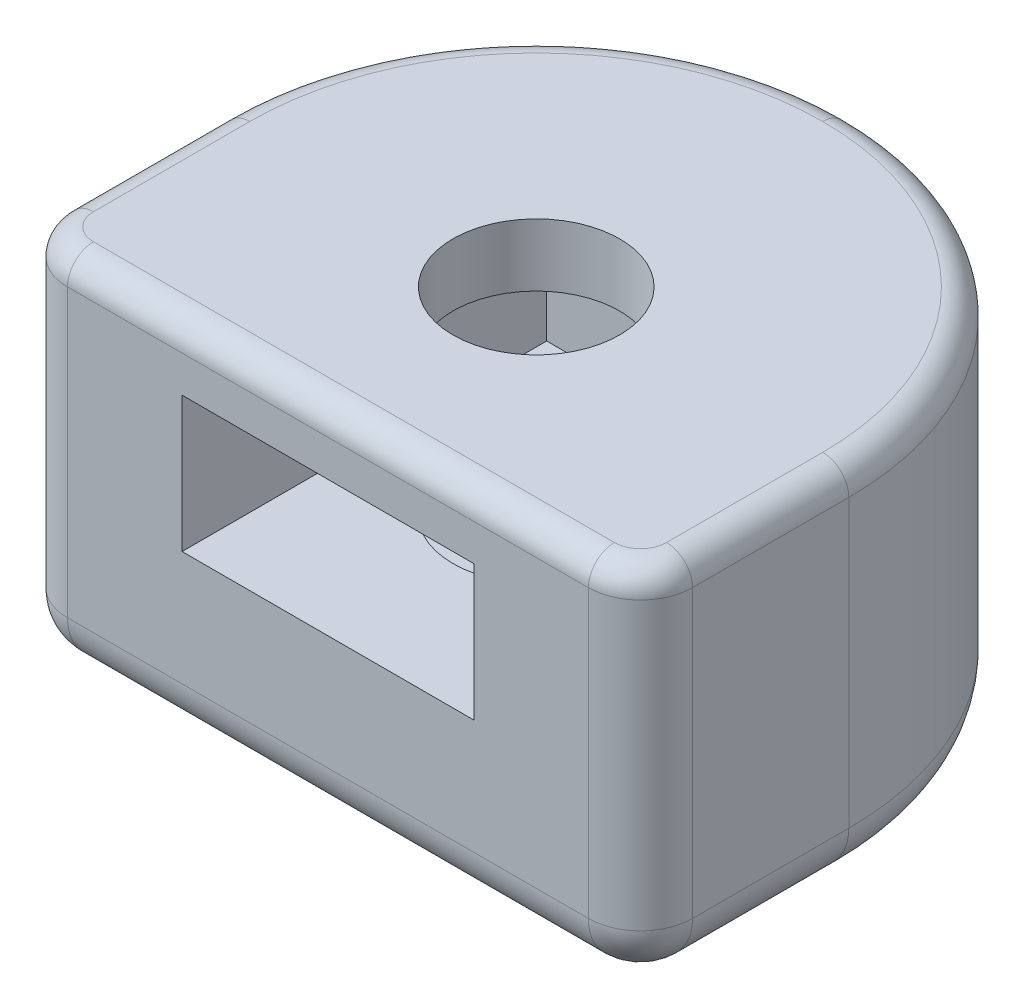
ISO-10303-21;
HEADER;
FILE_DESCRIPTION(('STEP AP214'),'2;1');
FILE_NAME('part.step','',(''),(''),'','','');
FILE_SCHEMA(('AUTOMOTIVE_DESIGN { 1 0 10303 214 1 1 1 1 }'));
ENDSEC;
DATA;
#1=APPLICATION_CONTEXT('core data for automotive mechanical design processes');
#2=APPLICATION_PROTOCOL_DEFINITION('international standard','automotive_design',2000,#1);
#3=PRODUCT_CONTEXT('',#1,'mechanical');
#4=PRODUCT('Part','Part','',(#3));
#5=PRODUCT_RELATED_PRODUCT_CATEGORY('part','',(#4));
#6=PRODUCT_DEFINITION_FORMATION('','',#4);
#7=PRODUCT_DEFINITION_CONTEXT('part definition',#1,'design');
#8=PRODUCT_DEFINITION('design','',#6,#7);
#9=PRODUCT_DEFINITION_SHAPE('','',#8);
#10=(LENGTH_UNIT() NAMED_UNIT(*) SI_UNIT(.MILLI.,.METRE.));
#11=(NAMED_UNIT(*) PLANE_ANGLE_UNIT() SI_UNIT($,.RADIAN.));
#12=(NAMED_UNIT(*) SI_UNIT($,.STERADIAN.) SOLID_ANGLE_UNIT());
#13=UNCERTAINTY_MEASURE_WITH_UNIT(LENGTH_MEASURE(1.E-05),#10,'distance_accuracy_value','');
#14=(GEOMETRIC_REPRESENTATION_CONTEXT(3) GLOBAL_UNCERTAINTY_ASSIGNED_CONTEXT((#13)) GLOBAL_UNIT_ASSIGNED_CONTEXT((#10,
#11,#12)) REPRESENTATION_CONTEXT('',''));
#15=CARTESIAN_POINT('',(0.,0.,0.));
#16=DIRECTION('',(0.,0.,1.));
#17=DIRECTION('',(1.,0.,0.));
#18=AXIS2_PLACEMENT_3D('',#15,#16,#17);
#19=CARTESIAN_POINT('',(6.,3.,-4.));
#20=DIRECTION('',(0.,1.,0.));
#21=DIRECTION('',(0.,0.,1.));
#22=AXIS2_PLACEMENT_3D('',#19,#20,#21);
#23=CYLINDRICAL_SURFACE('',#22,1.6);
#24=CARTESIAN_POINT('',(6.,5.8,-4.));
#25=DIRECTION('',(0.,1.,0.));
#26=DIRECTION('',(0.,0.,1.));
#27=AXIS2_PLACEMENT_3D('',#24,#25,#26);
#28=CIRCLE('',#27,1.6);
#29=CARTESIAN_POINT('',(6.,5.8,-2.4));
#30=VERTEX_POINT('',#29);
#31=EDGE_CURVE('E209',#30,#30,#28,.F.);
#32=ORIENTED_EDGE('',*,*,#31,.T.);
#33=EDGE_LOOP('',(#32));
#34=FACE_BOUND('',#33,.T.);
#35=CARTESIAN_POINT('',(6.,7.,-4.));
#36=DIRECTION('',(0.,1.,0.));
#37=DIRECTION('',(0.,0.,1.));
#38=AXIS2_PLACEMENT_3D('',#35,#36,#37);
#39=CIRCLE('',#38,1.6);
#40=CARTESIAN_POINT('',(6.,7.,-2.4));
#41=VERTEX_POINT('',#40);
#42=EDGE_CURVE('E206',#41,#41,#39,.T.);
#43=ORIENTED_EDGE('',*,*,#42,.T.);
#44=EDGE_LOOP('',(#43));
#45=FACE_BOUND('',#44,.T.);
#46=ADVANCED_FACE('F36',(#34,#45),#23,.F.);
#47=CARTESIAN_POINT('',(0.,7.,0.));
#48=DIRECTION('',(1.,0.,0.));
#49=DIRECTION('',(0.,0.,-1.));
#50=AXIS2_PLACEMENT_3D('',#47,#48,#49);
#51=PLANE('',#50);
#52=DIRECTION('',(0.,-1.,0.));
#53=VECTOR('',#52,1.);
#54=CARTESIAN_POINT('',(0.,7.,-1.));
#55=LINE('',#54,#53);
#56=CARTESIAN_POINT('',(0.,1.,-1.));
#57=VERTEX_POINT('',#56);
#58=CARTESIAN_POINT('',(0.,6.5,-1.));
#59=VERTEX_POINT('',#58);
#60=EDGE_CURVE('E254',#57,#59,#55,.F.);
#61=ORIENTED_EDGE('',*,*,#60,.T.);
#62=DIRECTION('',(0.,0.,1.));
#63=VECTOR('',#62,1.);
#64=CARTESIAN_POINT('',(0.,6.5,0.));
#65=LINE('',#64,#63);
#66=CARTESIAN_POINT('',(0.,6.5,-4.));
#67=VERTEX_POINT('',#66);
#68=EDGE_CURVE('E294',#59,#67,#65,.F.);
#69=ORIENTED_EDGE('',*,*,#68,.T.);
#70=DIRECTION('',(0.,-1.,0.));
#71=VECTOR('',#70,1.);
#72=CARTESIAN_POINT('',(0.,7.,-4.));
#73=LINE('',#72,#71);
#74=CARTESIAN_POINT('',(0.,1.,-4.));
#75=VERTEX_POINT('',#74);
#76=EDGE_CURVE('E205',#67,#75,#73,.T.);
#77=ORIENTED_EDGE('',*,*,#76,.T.);
#78=DIRECTION('',(0.,0.,1.));
#79=VECTOR('',#78,1.);
#80=CARTESIAN_POINT('',(0.,1.,0.));
#81=LINE('',#80,#79);
#82=EDGE_CURVE('E217',#75,#57,#81,.T.);
#83=ORIENTED_EDGE('',*,*,#82,.T.);
#84=EDGE_LOOP('',(#61,#69,#77,#83));
#85=FACE_BOUND('',#84,.T.);
#86=ADVANCED_FACE('F361',(#85),#51,.F.);
#87=CARTESIAN_POINT('',(0.,7.,0.));
#88=DIRECTION('',(0.,0.,-1.));
#89=DIRECTION('',(-1.,0.,0.));
#90=AXIS2_PLACEMENT_3D('',#87,#88,#89);
#91=PLANE('',#90);
#92=DIRECTION('',(0.,-1.,0.));
#93=VECTOR('',#92,1.);
#94=CARTESIAN_POINT('',(11.,7.,0.));
#95=LINE('',#94,#93);
#96=CARTESIAN_POINT('',(11.,1.,0.));
#97=VERTEX_POINT('',#96);
#98=CARTESIAN_POINT('',(11.,6.5,0.));
#99=VERTEX_POINT('',#98);
#100=EDGE_CURVE('E250',#97,#99,#95,.F.);
#101=ORIENTED_EDGE('',*,*,#100,.T.);
#102=DIRECTION('',(1.,0.,0.));
#103=VECTOR('',#102,1.);
#104=CARTESIAN_POINT('',(0.,6.5,0.));
#105=LINE('',#104,#103);
#106=CARTESIAN_POINT('',(1.,6.5,0.));
#107=VERTEX_POINT('',#106);
#108=EDGE_CURVE('E11',#99,#107,#105,.F.);
#109=ORIENTED_EDGE('',*,*,#108,.T.);
#110=DIRECTION('',(0.,-1.,0.));
#111=VECTOR('',#110,1.);
#112=CARTESIAN_POINT('',(1.,7.,0.));
#113=LINE('',#112,#111);
#114=CARTESIAN_POINT('',(1.,1.,0.));
#115=VERTEX_POINT('',#114);
#116=EDGE_CURVE('E252',#107,#115,#113,.T.);
#117=ORIENTED_EDGE('',*,*,#116,.T.);
#118=DIRECTION('',(1.,0.,0.));
#119=VECTOR('',#118,1.);
#120=CARTESIAN_POINT('',(11.,1.,0.));
#121=LINE('',#120,#119);
#122=EDGE_CURVE('E239',#115,#97,#121,.T.);
#123=ORIENTED_EDGE('',*,*,#122,.T.);
#124=EDGE_LOOP('',(#101,#109,#117,#123));
#125=FACE_BOUND('',#124,.T.);
#126=DIRECTION('',(1.,0.,0.));
#127=VECTOR('',#126,1.);
#128=CARTESIAN_POINT('',(3.2,3.2,0.));
#129=LINE('',#128,#127);
#130=CARTESIAN_POINT('',(3.2,3.2,0.));
#131=VERTEX_POINT('',#130);
#132=CARTESIAN_POINT('',(8.8,3.2,0.));
#133=VERTEX_POINT('',#132);
#134=EDGE_CURVE('E191',#131,#133,#129,.T.);
#135=ORIENTED_EDGE('',*,*,#134,.F.);
#136=DIRECTION('',(0.,-1.,0.));
#137=VECTOR('',#136,1.);
#138=CARTESIAN_POINT('',(3.2,5.8,0.));
#139=LINE('',#138,#137);
#140=CARTESIAN_POINT('',(3.2,5.8,0.));
#141=VERTEX_POINT('',#140);
#142=EDGE_CURVE('E164',#141,#131,#139,.T.);
#143=ORIENTED_EDGE('',*,*,#142,.F.);
#144=DIRECTION('',(-1.,0.,0.));
#145=VECTOR('',#144,1.);
#146=CARTESIAN_POINT('',(3.2,5.8,0.));
#147=LINE('',#146,#145);
#148=CARTESIAN_POINT('',(8.8,5.8,0.));
#149=VERTEX_POINT('',#148);
#150=EDGE_CURVE('E182',#149,#141,#147,.T.);
#151=ORIENTED_EDGE('',*,*,#150,.F.);
#152=DIRECTION('',(0.,1.,0.));
#153=VECTOR('',#152,1.);
#154=CARTESIAN_POINT('',(8.8,5.8,0.));
#155=LINE('',#154,#153);
#156=EDGE_CURVE('E185',#133,#149,#155,.T.);
#157=ORIENTED_EDGE('',*,*,#156,.F.);
#158=EDGE_LOOP('',(#135,#143,#151,#157));
#159=FACE_BOUND('',#158,.T.);
#160=ADVANCED_FACE('F344',(#125,#159),#91,.F.);
#161=CARTESIAN_POINT('',(12.,7.,0.));
#162=DIRECTION('',(-1.,0.,0.));
#163=DIRECTION('',(0.,0.,1.));
#164=AXIS2_PLACEMENT_3D('',#161,#162,#163);
#165=PLANE('',#164);
#166=DIRECTION('',(0.,-1.,0.));
#167=VECTOR('',#166,1.);
#168=CARTESIAN_POINT('',(12.,7.,-4.));
#169=LINE('',#168,#167);
#170=CARTESIAN_POINT('',(12.,1.,-4.));
#171=VERTEX_POINT('',#170);
#172=CARTESIAN_POINT('',(12.,6.5,-4.));
#173=VERTEX_POINT('',#172);
#174=EDGE_CURVE('E215',#171,#173,#169,.F.);
#175=ORIENTED_EDGE('',*,*,#174,.T.);
#176=DIRECTION('',(0.,0.,-1.));
#177=VECTOR('',#176,1.);
#178=CARTESIAN_POINT('',(12.,6.5,0.));
#179=LINE('',#178,#177);
#180=CARTESIAN_POINT('',(12.,6.5,-1.));
#181=VERTEX_POINT('',#180);
#182=EDGE_CURVE('E60',#173,#181,#179,.F.);
#183=ORIENTED_EDGE('',*,*,#182,.T.);
#184=DIRECTION('',(0.,-1.,0.));
#185=VECTOR('',#184,1.);
#186=CARTESIAN_POINT('',(12.,7.,-1.));
#187=LINE('',#186,#185);
#188=CARTESIAN_POINT('',(12.,1.,-1.));
#189=VERTEX_POINT('',#188);
#190=EDGE_CURVE('E259',#181,#189,#187,.T.);
#191=ORIENTED_EDGE('',*,*,#190,.T.);
#192=DIRECTION('',(0.,0.,-1.));
#193=VECTOR('',#192,1.);
#194=CARTESIAN_POINT('',(12.,1.,-4.));
#195=LINE('',#194,#193);
#196=EDGE_CURVE('E231',#189,#171,#195,.T.);
#197=ORIENTED_EDGE('',*,*,#196,.T.);
#198=EDGE_LOOP('',(#175,#183,#191,#197));
#199=FACE_BOUND('',#198,.T.);
#200=ADVANCED_FACE('F606',(#199),#165,.F.);
#201=CARTESIAN_POINT('',(0.,7.,0.));
#202=DIRECTION('',(0.,-1.,0.));
#203=DIRECTION('',(0.,0.,-1.));
#204=AXIS2_PLACEMENT_3D('',#201,#202,#203);
#205=PLANE('',#204);
#206=DIRECTION('',(0.,0.,1.));
#207=VECTOR('',#206,1.);
#208=CARTESIAN_POINT('',(0.5,7.,0.));
#209=LINE('',#208,#207);
#210=CARTESIAN_POINT('',(0.5,7.,-4.));
#211=VERTEX_POINT('',#210);
#212=CARTESIAN_POINT('',(0.5,7.,-1.));
#213=VERTEX_POINT('',#212);
#214=EDGE_CURVE('E286',#211,#213,#209,.T.);
#215=ORIENTED_EDGE('',*,*,#214,.T.);
#216=CARTESIAN_POINT('',(1.,7.,-1.));
#217=DIRECTION('',(0.,-1.,0.));
#218=DIRECTION('',(0.,0.,-1.));
#219=AXIS2_PLACEMENT_3D('',#216,#217,#218);
#220=CIRCLE('',#219,0.5);
#221=CARTESIAN_POINT('',(1.,7.,-0.5));
#222=VERTEX_POINT('',#221);
#223=EDGE_CURVE('E288',#213,#222,#220,.F.);
#224=ORIENTED_EDGE('',*,*,#223,.T.);
#225=DIRECTION('',(1.,0.,0.));
#226=VECTOR('',#225,1.);
#227=CARTESIAN_POINT('',(0.,7.,-0.5));
#228=LINE('',#227,#226);
#229=CARTESIAN_POINT('',(11.,7.,-0.5));
#230=VERTEX_POINT('',#229);
#231=EDGE_CURVE('E265',#222,#230,#228,.T.);
#232=ORIENTED_EDGE('',*,*,#231,.T.);
#233=CARTESIAN_POINT('',(11.,7.,-1.));
#234=DIRECTION('',(0.,-1.,0.));
#235=DIRECTION('',(0.,0.,-1.));
#236=AXIS2_PLACEMENT_3D('',#233,#234,#235);
#237=CIRCLE('',#236,0.5);
#238=CARTESIAN_POINT('',(11.5,7.,-1.));
#239=VERTEX_POINT('',#238);
#240=EDGE_CURVE('E278',#230,#239,#237,.F.);
#241=ORIENTED_EDGE('',*,*,#240,.T.);
#242=DIRECTION('',(0.,0.,-1.));
#243=VECTOR('',#242,1.);
#244=CARTESIAN_POINT('',(11.5,7.,0.));
#245=LINE('',#244,#243);
#246=CARTESIAN_POINT('',(11.5,7.,-4.));
#247=VERTEX_POINT('',#246);
#248=EDGE_CURVE('E280',#239,#247,#245,.T.);
#249=ORIENTED_EDGE('',*,*,#248,.T.);
#250=CARTESIAN_POINT('',(6.,7.,-4.));
#251=DIRECTION('',(0.,-1.,0.));
#252=DIRECTION('',(0.,0.,-1.));
#253=AXIS2_PLACEMENT_3D('',#250,#251,#252);
#254=CIRCLE('',#253,5.5);
#255=CARTESIAN_POINT('',(6.,7.,-9.5));
#256=VERTEX_POINT('',#255);
#257=EDGE_CURVE('E282',#247,#256,#254,.F.);
#258=ORIENTED_EDGE('',*,*,#257,.T.);
#259=CARTESIAN_POINT('',(6.,7.,-4.));
#260=DIRECTION('',(0.,-1.,0.));
#261=DIRECTION('',(0.,0.,-1.));
#262=AXIS2_PLACEMENT_3D('',#259,#260,#261);
#263=CIRCLE('',#262,5.5);
#264=EDGE_CURVE('E284',#256,#211,#263,.F.);
#265=ORIENTED_EDGE('',*,*,#264,.T.);
#266=EDGE_LOOP('',(#215,#224,#232,#241,#249,#258,#265));
#267=FACE_BOUND('',#266,.T.);
#268=ORIENTED_EDGE('',*,*,#42,.F.);
#269=EDGE_LOOP('',(#268));
#270=FACE_BOUND('',#269,.T.);
#271=ADVANCED_FACE('F330',(#267,#270),#205,.F.);
#272=CARTESIAN_POINT('',(0.,0.,0.));
#273=DIRECTION('',(0.,-1.,0.));
#274=DIRECTION('',(0.,0.,-1.));
#275=AXIS2_PLACEMENT_3D('',#272,#273,#274);
#276=PLANE('',#275);
#277=DIRECTION('',(0.,0.,-1.));
#278=VECTOR('',#277,1.);
#279=CARTESIAN_POINT('',(11.,0.,0.));
#280=LINE('',#279,#278);
#281=CARTESIAN_POINT('',(11.,0.,-4.));
#282=VERTEX_POINT('',#281);
#283=CARTESIAN_POINT('',(11.,0.,-1.));
#284=VERTEX_POINT('',#283);
#285=EDGE_CURVE('E226',#282,#284,#280,.F.);
#286=ORIENTED_EDGE('',*,*,#285,.T.);
#287=DIRECTION('',(1.,0.,0.));
#288=VECTOR('',#287,1.);
#289=CARTESIAN_POINT('',(1.,0.,-1.));
#290=LINE('',#289,#288);
#291=CARTESIAN_POINT('',(1.,0.,-1.));
#292=VERTEX_POINT('',#291);
#293=EDGE_CURVE('E263',#284,#292,#290,.F.);
#294=ORIENTED_EDGE('',*,*,#293,.T.);
#295=DIRECTION('',(0.,0.,1.));
#296=VECTOR('',#295,1.);
#297=CARTESIAN_POINT('',(1.,0.,-4.));
#298=LINE('',#297,#296);
#299=CARTESIAN_POINT('',(1.,0.,-4.));
#300=VERTEX_POINT('',#299);
#301=EDGE_CURVE('E229',#292,#300,#298,.F.);
#302=ORIENTED_EDGE('',*,*,#301,.T.);
#303=CARTESIAN_POINT('',(6.,0.,-4.));
#304=DIRECTION('',(0.,-1.,0.));
#305=DIRECTION('',(0.,0.,-1.));
#306=AXIS2_PLACEMENT_3D('',#303,#304,#305);
#307=CIRCLE('',#306,5.);
#308=CARTESIAN_POINT('',(6.,0.,-9.));
#309=VERTEX_POINT('',#308);
#310=EDGE_CURVE('E222',#300,#309,#307,.T.);
#311=ORIENTED_EDGE('',*,*,#310,.T.);
#312=CARTESIAN_POINT('',(6.,0.,-4.));
#313=DIRECTION('',(0.,-1.,0.));
#314=DIRECTION('',(0.,0.,-1.));
#315=AXIS2_PLACEMENT_3D('',#312,#313,#314);
#316=CIRCLE('',#315,5.);
#317=EDGE_CURVE('E224',#309,#282,#316,.T.);
#318=ORIENTED_EDGE('',*,*,#317,.T.);
#319=EDGE_LOOP('',(#286,#294,#302,#311,#318));
#320=FACE_BOUND('',#319,.T.);
#321=ADVANCED_FACE('F409',(#320),#276,.T.);
#322=CARTESIAN_POINT('',(3.2,5.8,-7.));
#323=DIRECTION('',(0.,1.,0.));
#324=DIRECTION('',(0.,0.,1.));
#325=AXIS2_PLACEMENT_3D('',#322,#323,#324);
#326=PLANE('',#325);
#327=ORIENTED_EDGE('',*,*,#150,.T.);
#328=DIRECTION('',(0.,0.,1.));
#329=VECTOR('',#328,1.);
#330=CARTESIAN_POINT('',(3.2,5.8,-7.));
#331=LINE('',#330,#329);
#332=CARTESIAN_POINT('',(3.2,5.8,-7.));
#333=VERTEX_POINT('',#332);
#334=EDGE_CURVE('E196',#333,#141,#331,.T.);
#335=ORIENTED_EDGE('',*,*,#334,.F.);
#336=DIRECTION('',(-1.,0.,0.));
#337=VECTOR('',#336,1.);
#338=CARTESIAN_POINT('',(3.2,5.8,-7.));
#339=LINE('',#338,#337);
#340=CARTESIAN_POINT('',(8.8,5.8,-7.));
#341=VERTEX_POINT('',#340);
#342=EDGE_CURVE('E169',#341,#333,#339,.T.);
#343=ORIENTED_EDGE('',*,*,#342,.F.);
#344=DIRECTION('',(0.,0.,1.));
#345=VECTOR('',#344,1.);
#346=CARTESIAN_POINT('',(8.8,5.8,-7.));
#347=LINE('',#346,#345);
#348=EDGE_CURVE('E199',#341,#149,#347,.T.);
#349=ORIENTED_EDGE('',*,*,#348,.T.);
#350=EDGE_LOOP('',(#327,#335,#343,#349));
#351=FACE_BOUND('',#350,.T.);
#352=ORIENTED_EDGE('',*,*,#31,.F.);
#353=EDGE_LOOP('',(#352));
#354=FACE_BOUND('',#353,.T.);
#355=ADVANCED_FACE('F401',(#351,#354),#326,.F.);
#356=CARTESIAN_POINT('',(3.2,3.2,-7.));
#357=DIRECTION('',(0.,-1.,0.));
#358=DIRECTION('',(0.,0.,-1.));
#359=AXIS2_PLACEMENT_3D('',#356,#357,#358);
#360=PLANE('',#359);
#361=ORIENTED_EDGE('',*,*,#134,.T.);
#362=DIRECTION('',(0.,0.,1.));
#363=VECTOR('',#362,1.);
#364=CARTESIAN_POINT('',(8.8,3.2,-7.));
#365=LINE('',#364,#363);
#366=CARTESIAN_POINT('',(8.8,3.2,-7.));
#367=VERTEX_POINT('',#366);
#368=EDGE_CURVE('E168',#367,#133,#365,.T.);
#369=ORIENTED_EDGE('',*,*,#368,.F.);
#370=DIRECTION('',(1.,0.,0.));
#371=VECTOR('',#370,1.);
#372=CARTESIAN_POINT('',(3.2,3.2,-7.));
#373=LINE('',#372,#371);
#374=CARTESIAN_POINT('',(3.2,3.2,-7.));
#375=VERTEX_POINT('',#374);
#376=EDGE_CURVE('E172',#375,#367,#373,.T.);
#377=ORIENTED_EDGE('',*,*,#376,.F.);
#378=DIRECTION('',(0.,0.,1.));
#379=VECTOR('',#378,1.);
#380=CARTESIAN_POINT('',(3.2,3.2,-7.));
#381=LINE('',#380,#379);
#382=EDGE_CURVE('E157',#375,#131,#381,.T.);
#383=ORIENTED_EDGE('',*,*,#382,.T.);
#384=EDGE_LOOP('',(#361,#369,#377,#383));
#385=FACE_BOUND('',#384,.T.);
#386=CARTESIAN_POINT('',(6.,3.2,-4.));
#387=DIRECTION('',(0.,-1.,0.));
#388=DIRECTION('',(0.,0.,-1.));
#389=AXIS2_PLACEMENT_3D('',#386,#387,#388);
#390=CIRCLE('',#389,1.6);
#391=CARTESIAN_POINT('',(6.,3.2,-5.6));
#392=VERTEX_POINT('',#391);
#393=EDGE_CURVE('E198',#392,#392,#390,.F.);
#394=ORIENTED_EDGE('',*,*,#393,.F.);
#395=EDGE_LOOP('',(#394));
#396=FACE_BOUND('',#395,.T.);
#397=ADVANCED_FACE('F173',(#385,#396),#360,.F.);
#398=CARTESIAN_POINT('',(3.2,5.8,-7.));
#399=DIRECTION('',(-1.,0.,0.));
#400=DIRECTION('',(0.,-1.,0.));
#401=AXIS2_PLACEMENT_3D('',#398,#399,#400);
#402=PLANE('',#401);
#403=ORIENTED_EDGE('',*,*,#142,.T.);
#404=ORIENTED_EDGE('',*,*,#382,.F.);
#405=DIRECTION('',(0.,-1.,0.));
#406=VECTOR('',#405,1.);
#407=CARTESIAN_POINT('',(3.2,5.8,-7.));
#408=LINE('',#407,#406);
#409=EDGE_CURVE('E161',#333,#375,#408,.T.);
#410=ORIENTED_EDGE('',*,*,#409,.F.);
#411=ORIENTED_EDGE('',*,*,#334,.T.);
#412=EDGE_LOOP('',(#403,#404,#410,#411));
#413=FACE_BOUND('',#412,.T.);
#414=ADVANCED_FACE('F159',(#413),#402,.F.);
#415=CARTESIAN_POINT('',(8.8,5.8,-7.));
#416=DIRECTION('',(1.,0.,0.));
#417=DIRECTION('',(0.,1.,0.));
#418=AXIS2_PLACEMENT_3D('',#415,#416,#417);
#419=PLANE('',#418);
#420=ORIENTED_EDGE('',*,*,#156,.T.);
#421=ORIENTED_EDGE('',*,*,#348,.F.);
#422=DIRECTION('',(0.,1.,0.));
#423=VECTOR('',#422,1.);
#424=CARTESIAN_POINT('',(8.8,5.8,-7.));
#425=LINE('',#424,#423);
#426=EDGE_CURVE('E178',#367,#341,#425,.T.);
#427=ORIENTED_EDGE('',*,*,#426,.F.);
#428=ORIENTED_EDGE('',*,*,#368,.T.);
#429=EDGE_LOOP('',(#420,#421,#427,#428));
#430=FACE_BOUND('',#429,.T.);
#431=ADVANCED_FACE('F407',(#430),#419,.F.);
#432=CARTESIAN_POINT('',(0.,0.,-7.));
#433=DIRECTION('',(0.,0.,1.));
#434=DIRECTION('',(1.,0.,0.));
#435=AXIS2_PLACEMENT_3D('',#432,#433,#434);
#436=PLANE('',#435);
#437=ORIENTED_EDGE('',*,*,#409,.T.);
#438=ORIENTED_EDGE('',*,*,#376,.T.);
#439=ORIENTED_EDGE('',*,*,#426,.T.);
#440=ORIENTED_EDGE('',*,*,#342,.T.);
#441=EDGE_LOOP('',(#437,#438,#439,#440));
#442=FACE_BOUND('',#441,.T.);
#443=ADVANCED_FACE('F180',(#442),#436,.T.);
#444=CARTESIAN_POINT('',(6.,3.,-4.));
#445=DIRECTION('',(0.,1.,0.));
#446=DIRECTION('',(0.,0.,1.));
#447=AXIS2_PLACEMENT_3D('',#444,#445,#446);
#448=PLANE('',#447);
#449=CARTESIAN_POINT('',(6.,3.,-4.));
#450=DIRECTION('',(0.,1.,0.));
#451=DIRECTION('',(0.,0.,1.));
#452=AXIS2_PLACEMENT_3D('',#449,#450,#451);
#453=CIRCLE('',#452,1.6);
#454=CARTESIAN_POINT('',(6.,3.,-2.4));
#455=VERTEX_POINT('',#454);
#456=EDGE_CURVE('E202',#455,#455,#453,.T.);
#457=ORIENTED_EDGE('',*,*,#456,.T.);
#458=EDGE_LOOP('',(#457));
#459=FACE_BOUND('',#458,.T.);
#460=ADVANCED_FACE('F388',(#459),#448,.T.);
#461=ORIENTED_EDGE('',*,*,#393,.T.);
#462=EDGE_LOOP('',(#461));
#463=FACE_BOUND('',#462,.T.);
#464=ORIENTED_EDGE('',*,*,#456,.F.);
#465=EDGE_LOOP('',(#464));
#466=FACE_BOUND('',#465,.T.);
#467=ADVANCED_FACE('F378',(#463,#466),#23,.F.);
#468=CARTESIAN_POINT('',(6.,7.,-4.));
#469=DIRECTION('',(0.,-1.,0.));
#470=DIRECTION('',(0.,0.,-1.));
#471=AXIS2_PLACEMENT_3D('',#468,#469,#470);
#472=CYLINDRICAL_SURFACE('',#471,6.);
#473=DIRECTION('',(0.,-1.,0.));
#474=VECTOR('',#473,1.);
#475=CARTESIAN_POINT('',(6.,7.,-10.));
#476=LINE('',#475,#474);
#477=CARTESIAN_POINT('',(6.,6.5,-10.));
#478=VERTEX_POINT('',#477);
#479=CARTESIAN_POINT('',(6.,1.,-10.));
#480=VERTEX_POINT('',#479);
#481=EDGE_CURVE('E192',#478,#480,#476,.T.);
#482=ORIENTED_EDGE('',*,*,#481,.F.);
#483=CARTESIAN_POINT('',(6.,6.5,-4.));
#484=DIRECTION('',(0.,-1.,0.));
#485=DIRECTION('',(0.,0.,-1.));
#486=AXIS2_PLACEMENT_3D('',#483,#484,#485);
#487=CIRCLE('',#486,6.);
#488=EDGE_CURVE('E298',#478,#173,#487,.T.);
#489=ORIENTED_EDGE('',*,*,#488,.T.);
#490=ORIENTED_EDGE('',*,*,#174,.F.);
#491=CARTESIAN_POINT('',(6.,1.,-4.));
#492=DIRECTION('',(0.,-1.,0.));
#493=DIRECTION('',(0.,0.,-1.));
#494=AXIS2_PLACEMENT_3D('',#491,#492,#493);
#495=CIRCLE('',#494,6.);
#496=EDGE_CURVE('E233',#171,#480,#495,.F.);
#497=ORIENTED_EDGE('',*,*,#496,.T.);
#498=EDGE_LOOP('',(#482,#489,#490,#497));
#499=FACE_BOUND('',#498,.T.);
#500=ADVANCED_FACE('F387',(#499),#472,.T.);
#501=CARTESIAN_POINT('',(6.,7.,-4.));
#502=DIRECTION('',(0.,-1.,0.));
#503=DIRECTION('',(0.,0.,-1.));
#504=AXIS2_PLACEMENT_3D('',#501,#502,#503);
#505=CYLINDRICAL_SURFACE('',#504,6.);
#506=ORIENTED_EDGE('',*,*,#76,.F.);
#507=CARTESIAN_POINT('',(6.,6.5,-4.));
#508=DIRECTION('',(0.,-1.,0.));
#509=DIRECTION('',(0.,0.,-1.));
#510=AXIS2_PLACEMENT_3D('',#507,#508,#509);
#511=CIRCLE('',#510,6.);
#512=EDGE_CURVE('E296',#67,#478,#511,.T.);
#513=ORIENTED_EDGE('',*,*,#512,.T.);
#514=ORIENTED_EDGE('',*,*,#481,.T.);
#515=CARTESIAN_POINT('',(6.,1.,-4.));
#516=DIRECTION('',(0.,-1.,0.));
#517=DIRECTION('',(0.,0.,-1.));
#518=AXIS2_PLACEMENT_3D('',#515,#516,#517);
#519=CIRCLE('',#518,6.);
#520=EDGE_CURVE('E236',#480,#75,#519,.F.);
#521=ORIENTED_EDGE('',*,*,#520,.T.);
#522=EDGE_LOOP('',(#506,#513,#514,#521));
#523=FACE_BOUND('',#522,.T.);
#524=ADVANCED_FACE('F363',(#523),#505,.T.);
#525=CARTESIAN_POINT('',(11.,1.,0.));
#526=DIRECTION('',(0.,0.,1.));
#527=DIRECTION('',(1.,0.,0.));
#528=AXIS2_PLACEMENT_3D('',#525,#526,#527);
#529=CYLINDRICAL_SURFACE('',#528,1.);
#530=ORIENTED_EDGE('',*,*,#196,.F.);
#531=CARTESIAN_POINT('',(11.,1.,-1.));
#532=DIRECTION('',(0.,0.,1.));
#533=DIRECTION('',(1.,0.,0.));
#534=AXIS2_PLACEMENT_3D('',#531,#532,#533);
#535=CIRCLE('',#534,1.);
#536=EDGE_CURVE('E261',#189,#284,#535,.F.);
#537=ORIENTED_EDGE('',*,*,#536,.T.);
#538=ORIENTED_EDGE('',*,*,#285,.F.);
#539=CARTESIAN_POINT('',(11.,1.,-4.));
#540=DIRECTION('',(0.,0.,-1.));
#541=DIRECTION('',(-1.,0.,0.));
#542=AXIS2_PLACEMENT_3D('',#539,#540,#541);
#543=CIRCLE('',#542,1.);
#544=EDGE_CURVE('E219',#171,#282,#543,.T.);
#545=ORIENTED_EDGE('',*,*,#544,.F.);
#546=EDGE_LOOP('',(#530,#537,#538,#545));
#547=FACE_BOUND('',#546,.T.);
#548=ADVANCED_FACE('F469',(#547),#529,.T.);
#549=CARTESIAN_POINT('',(6.,1.,-4.));
#550=DIRECTION('',(0.,-1.,0.));
#551=DIRECTION('',(0.,0.,-1.));
#552=AXIS2_PLACEMENT_3D('',#549,#550,#551);
#553=TOROIDAL_SURFACE('',#552,5.,1.);
#554=ORIENTED_EDGE('',*,*,#544,.T.);
#555=ORIENTED_EDGE('',*,*,#317,.F.);
#556=CARTESIAN_POINT('',(6.,1.,-9.));
#557=DIRECTION('',(-1.,0.,0.));
#558=DIRECTION('',(0.,0.,1.));
#559=AXIS2_PLACEMENT_3D('',#556,#557,#558);
#560=CIRCLE('',#559,1.);
#561=EDGE_CURVE('E243',#480,#309,#560,.T.);
#562=ORIENTED_EDGE('',*,*,#561,.F.);
#563=ORIENTED_EDGE('',*,*,#496,.F.);
#564=EDGE_LOOP('',(#554,#555,#562,#563));
#565=FACE_BOUND('',#564,.T.);
#566=ADVANCED_FACE('F478',(#565),#553,.T.);
#567=CARTESIAN_POINT('',(6.,1.,-4.));
#568=DIRECTION('',(0.,-1.,0.));
#569=DIRECTION('',(0.,0.,-1.));
#570=AXIS2_PLACEMENT_3D('',#567,#568,#569);
#571=TOROIDAL_SURFACE('',#570,5.,1.);
#572=ORIENTED_EDGE('',*,*,#561,.T.);
#573=ORIENTED_EDGE('',*,*,#310,.F.);
#574=CARTESIAN_POINT('',(1.,1.,-4.));
#575=DIRECTION('',(0.,0.,1.));
#576=DIRECTION('',(1.,0.,0.));
#577=AXIS2_PLACEMENT_3D('',#574,#575,#576);
#578=CIRCLE('',#577,1.);
#579=EDGE_CURVE('E240',#75,#300,#578,.T.);
#580=ORIENTED_EDGE('',*,*,#579,.F.);
#581=ORIENTED_EDGE('',*,*,#520,.F.);
#582=EDGE_LOOP('',(#572,#573,#580,#581));
#583=FACE_BOUND('',#582,.T.);
#584=ADVANCED_FACE('F489',(#583),#571,.T.);
#585=CARTESIAN_POINT('',(1.,1.,0.));
#586=DIRECTION('',(0.,0.,-1.));
#587=DIRECTION('',(-1.,0.,0.));
#588=AXIS2_PLACEMENT_3D('',#585,#586,#587);
#589=CYLINDRICAL_SURFACE('',#588,1.);
#590=ORIENTED_EDGE('',*,*,#301,.F.);
#591=CARTESIAN_POINT('',(1.,1.,-1.));
#592=DIRECTION('',(0.,0.,-1.));
#593=DIRECTION('',(-1.,0.,0.));
#594=AXIS2_PLACEMENT_3D('',#591,#592,#593);
#595=CIRCLE('',#594,1.);
#596=EDGE_CURVE('E257',#292,#57,#595,.T.);
#597=ORIENTED_EDGE('',*,*,#596,.T.);
#598=ORIENTED_EDGE('',*,*,#82,.F.);
#599=ORIENTED_EDGE('',*,*,#579,.T.);
#600=EDGE_LOOP('',(#590,#597,#598,#599));
#601=FACE_BOUND('',#600,.T.);
#602=ADVANCED_FACE('F498',(#601),#589,.T.);
#603=CARTESIAN_POINT('',(11.,7.,-1.));
#604=DIRECTION('',(0.,-1.,0.));
#605=DIRECTION('',(0.,0.,-1.));
#606=AXIS2_PLACEMENT_3D('',#603,#604,#605);
#607=CYLINDRICAL_SURFACE('',#606,1.);
#608=ORIENTED_EDGE('',*,*,#190,.F.);
#609=CARTESIAN_POINT('',(11.,6.5,-1.));
#610=DIRECTION('',(0.,-1.,0.));
#611=DIRECTION('',(0.,0.,-1.));
#612=AXIS2_PLACEMENT_3D('',#609,#610,#611);
#613=CIRCLE('',#612,1.);
#614=EDGE_CURVE('E45',#181,#99,#613,.T.);
#615=ORIENTED_EDGE('',*,*,#614,.T.);
#616=ORIENTED_EDGE('',*,*,#100,.F.);
#617=CARTESIAN_POINT('',(11.,1.,-1.));
#618=DIRECTION('',(0.,-1.,0.));
#619=DIRECTION('',(0.,0.,-1.));
#620=AXIS2_PLACEMENT_3D('',#617,#618,#619);
#621=CIRCLE('',#620,1.);
#622=EDGE_CURVE('E244',#189,#97,#621,.T.);
#623=ORIENTED_EDGE('',*,*,#622,.F.);
#624=EDGE_LOOP('',(#608,#615,#616,#623));
#625=FACE_BOUND('',#624,.T.);
#626=ADVANCED_FACE('F506',(#625),#607,.T.);
#627=CARTESIAN_POINT('',(11.,1.,-1.));
#628=DIRECTION('',(0.,0.,-1.));
#629=DIRECTION('',(-1.,0.,0.));
#630=AXIS2_PLACEMENT_3D('',#627,#628,#629);
#631=SPHERICAL_SURFACE('',#630,1.);
#632=ORIENTED_EDGE('',*,*,#536,.F.);
#633=ORIENTED_EDGE('',*,*,#622,.T.);
#634=CARTESIAN_POINT('',(11.,1.,-1.));
#635=DIRECTION('',(-1.,0.,0.));
#636=DIRECTION('',(0.,0.,1.));
#637=AXIS2_PLACEMENT_3D('',#634,#635,#636);
#638=CIRCLE('',#637,1.);
#639=EDGE_CURVE('E272',#284,#97,#638,.T.);
#640=ORIENTED_EDGE('',*,*,#639,.F.);
#641=EDGE_LOOP('',(#632,#633,#640));
#642=FACE_BOUND('',#641,.T.);
#643=ADVANCED_FACE('F515',(#642),#631,.T.);
#644=CARTESIAN_POINT('',(0.,1.,-1.));
#645=DIRECTION('',(-1.,0.,0.));
#646=DIRECTION('',(0.,0.,1.));
#647=AXIS2_PLACEMENT_3D('',#644,#645,#646);
#648=CYLINDRICAL_SURFACE('',#647,1.);
#649=CARTESIAN_POINT('',(1.,1.,-1.));
#650=DIRECTION('',(-1.,0.,0.));
#651=DIRECTION('',(0.,0.,1.));
#652=AXIS2_PLACEMENT_3D('',#649,#650,#651);
#653=CIRCLE('',#652,1.);
#654=EDGE_CURVE('E269',#292,#115,#653,.T.);
#655=ORIENTED_EDGE('',*,*,#654,.F.);
#656=ORIENTED_EDGE('',*,*,#293,.F.);
#657=ORIENTED_EDGE('',*,*,#639,.T.);
#658=ORIENTED_EDGE('',*,*,#122,.F.);
#659=EDGE_LOOP('',(#655,#656,#657,#658));
#660=FACE_BOUND('',#659,.T.);
#661=ADVANCED_FACE('F524',(#660),#648,.T.);
#662=CARTESIAN_POINT('',(1.,1.,-1.));
#663=DIRECTION('',(0.,0.,-1.));
#664=DIRECTION('',(-1.,0.,0.));
#665=AXIS2_PLACEMENT_3D('',#662,#663,#664);
#666=SPHERICAL_SURFACE('',#665,1.);
#667=ORIENTED_EDGE('',*,*,#596,.F.);
#668=ORIENTED_EDGE('',*,*,#654,.T.);
#669=CARTESIAN_POINT('',(1.,1.,-1.));
#670=DIRECTION('',(0.,1.,0.));
#671=DIRECTION('',(0.,0.,1.));
#672=AXIS2_PLACEMENT_3D('',#669,#670,#671);
#673=CIRCLE('',#672,1.);
#674=EDGE_CURVE('E266',#57,#115,#673,.T.);
#675=ORIENTED_EDGE('',*,*,#674,.F.);
#676=EDGE_LOOP('',(#667,#668,#675));
#677=FACE_BOUND('',#676,.T.);
#678=ADVANCED_FACE('F536',(#677),#666,.T.);
#679=CARTESIAN_POINT('',(1.,7.,-1.));
#680=DIRECTION('',(0.,-1.,0.));
#681=DIRECTION('',(0.,0.,-1.));
#682=AXIS2_PLACEMENT_3D('',#679,#680,#681);
#683=CYLINDRICAL_SURFACE('',#682,1.);
#684=ORIENTED_EDGE('',*,*,#116,.F.);
#685=CARTESIAN_POINT('',(1.,6.5,-1.));
#686=DIRECTION('',(0.,-1.,0.));
#687=DIRECTION('',(0.,0.,-1.));
#688=AXIS2_PLACEMENT_3D('',#685,#686,#687);
#689=CIRCLE('',#688,1.);
#690=EDGE_CURVE('E291',#107,#59,#689,.T.);
#691=ORIENTED_EDGE('',*,*,#690,.T.);
#692=ORIENTED_EDGE('',*,*,#60,.F.);
#693=ORIENTED_EDGE('',*,*,#674,.T.);
#694=EDGE_LOOP('',(#684,#691,#692,#693));
#695=FACE_BOUND('',#694,.T.);
#696=ADVANCED_FACE('F348',(#695),#683,.T.);
#697=CARTESIAN_POINT('',(6.,6.5,-4.));
#698=DIRECTION('',(0.,-1.,0.));
#699=DIRECTION('',(0.,0.,-1.));
#700=AXIS2_PLACEMENT_3D('',#697,#698,#699);
#701=TOROIDAL_SURFACE('',#700,5.5,0.5);
#702=CARTESIAN_POINT('',(6.,6.5,-9.5));
#703=DIRECTION('',(-1.,0.,0.));
#704=DIRECTION('',(0.,0.,1.));
#705=AXIS2_PLACEMENT_3D('',#702,#703,#704);
#706=CIRCLE('',#705,0.5);
#707=EDGE_CURVE('E314',#256,#478,#706,.T.);
#708=ORIENTED_EDGE('',*,*,#707,.F.);
#709=ORIENTED_EDGE('',*,*,#257,.F.);
#710=CARTESIAN_POINT('',(11.5,6.5,-4.));
#711=DIRECTION('',(0.,0.,1.));
#712=DIRECTION('',(1.,0.,0.));
#713=AXIS2_PLACEMENT_3D('',#710,#711,#712);
#714=CIRCLE('',#713,0.5);
#715=EDGE_CURVE('E40',#173,#247,#714,.T.);
#716=ORIENTED_EDGE('',*,*,#715,.F.);
#717=ORIENTED_EDGE('',*,*,#488,.F.);
#718=EDGE_LOOP('',(#708,#709,#716,#717));
#719=FACE_BOUND('',#718,.T.);
#720=ADVANCED_FACE('F38',(#719),#701,.T.);
#721=CARTESIAN_POINT('',(11.5,6.5,0.));
#722=DIRECTION('',(0.,0.,-1.));
#723=DIRECTION('',(-1.,0.,0.));
#724=AXIS2_PLACEMENT_3D('',#721,#722,#723);
#725=CYLINDRICAL_SURFACE('',#724,0.5);
#726=ORIENTED_EDGE('',*,*,#715,.T.);
#727=ORIENTED_EDGE('',*,*,#248,.F.);
#728=CARTESIAN_POINT('',(11.5,6.5,-1.));
#729=DIRECTION('',(0.,0.,1.));
#730=DIRECTION('',(1.,0.,0.));
#731=AXIS2_PLACEMENT_3D('',#728,#729,#730);
#732=CIRCLE('',#731,0.5);
#733=EDGE_CURVE('E312',#181,#239,#732,.T.);
#734=ORIENTED_EDGE('',*,*,#733,.F.);
#735=ORIENTED_EDGE('',*,*,#182,.F.);
#736=EDGE_LOOP('',(#726,#727,#734,#735));
#737=FACE_BOUND('',#736,.T.);
#738=ADVANCED_FACE('F324',(#737),#725,.T.);
#739=CARTESIAN_POINT('',(6.,6.5,-4.));
#740=DIRECTION('',(0.,-1.,0.));
#741=DIRECTION('',(0.,0.,-1.));
#742=AXIS2_PLACEMENT_3D('',#739,#740,#741);
#743=TOROIDAL_SURFACE('',#742,5.5,0.5);
#744=ORIENTED_EDGE('',*,*,#707,.T.);
#745=ORIENTED_EDGE('',*,*,#512,.F.);
#746=CARTESIAN_POINT('',(0.5,6.5,-4.));
#747=DIRECTION('',(0.,0.,1.));
#748=DIRECTION('',(1.,0.,0.));
#749=AXIS2_PLACEMENT_3D('',#746,#747,#748);
#750=CIRCLE('',#749,0.5);
#751=EDGE_CURVE('E309',#211,#67,#750,.T.);
#752=ORIENTED_EDGE('',*,*,#751,.F.);
#753=ORIENTED_EDGE('',*,*,#264,.F.);
#754=EDGE_LOOP('',(#744,#745,#752,#753));
#755=FACE_BOUND('',#754,.T.);
#756=ADVANCED_FACE('F367',(#755),#743,.T.);
#757=CARTESIAN_POINT('',(11.,6.5,-1.));
#758=DIRECTION('',(0.,-1.,0.));
#759=DIRECTION('',(0.,0.,-1.));
#760=AXIS2_PLACEMENT_3D('',#757,#758,#759);
#761=DEGENERATE_TOROIDAL_SURFACE('',#760,0.5,0.5,.T.);
#762=ORIENTED_EDGE('',*,*,#733,.T.);
#763=ORIENTED_EDGE('',*,*,#240,.F.);
#764=CARTESIAN_POINT('',(11.,6.5,-0.5));
#765=DIRECTION('',(-1.,0.,0.));
#766=DIRECTION('',(0.,0.,1.));
#767=AXIS2_PLACEMENT_3D('',#764,#765,#766);
#768=CIRCLE('',#767,0.5);
#769=EDGE_CURVE('E306',#99,#230,#768,.T.);
#770=ORIENTED_EDGE('',*,*,#769,.F.);
#771=ORIENTED_EDGE('',*,*,#614,.F.);
#772=EDGE_LOOP('',(#762,#763,#770,#771));
#773=FACE_BOUND('',#772,.T.);
#774=ADVANCED_FACE('F337',(#773),#761,.T.);
#775=CARTESIAN_POINT('',(0.5,6.5,0.));
#776=DIRECTION('',(0.,0.,1.));
#777=DIRECTION('',(1.,0.,0.));
#778=AXIS2_PLACEMENT_3D('',#775,#776,#777);
#779=CYLINDRICAL_SURFACE('',#778,0.5);
#780=ORIENTED_EDGE('',*,*,#751,.T.);
#781=ORIENTED_EDGE('',*,*,#68,.F.);
#782=CARTESIAN_POINT('',(0.5,6.5,-1.));
#783=DIRECTION('',(0.,0.,1.));
#784=DIRECTION('',(1.,0.,0.));
#785=AXIS2_PLACEMENT_3D('',#782,#783,#784);
#786=CIRCLE('',#785,0.5);
#787=EDGE_CURVE('E304',#213,#59,#786,.T.);
#788=ORIENTED_EDGE('',*,*,#787,.F.);
#789=ORIENTED_EDGE('',*,*,#214,.F.);
#790=EDGE_LOOP('',(#780,#781,#788,#789));
#791=FACE_BOUND('',#790,.T.);
#792=ADVANCED_FACE('F358',(#791),#779,.T.);
#793=CARTESIAN_POINT('',(0.,6.5,-0.5));
#794=DIRECTION('',(1.,0.,0.));
#795=DIRECTION('',(0.,0.,-1.));
#796=AXIS2_PLACEMENT_3D('',#793,#794,#795);
#797=CYLINDRICAL_SURFACE('',#796,0.5);
#798=ORIENTED_EDGE('',*,*,#769,.T.);
#799=ORIENTED_EDGE('',*,*,#231,.F.);
#800=CARTESIAN_POINT('',(1.,6.5,-0.5));
#801=DIRECTION('',(-1.,0.,0.));
#802=DIRECTION('',(0.,0.,1.));
#803=AXIS2_PLACEMENT_3D('',#800,#801,#802);
#804=CIRCLE('',#803,0.5);
#805=EDGE_CURVE('E302',#107,#222,#804,.T.);
#806=ORIENTED_EDGE('',*,*,#805,.F.);
#807=ORIENTED_EDGE('',*,*,#108,.F.);
#808=EDGE_LOOP('',(#798,#799,#806,#807));
#809=FACE_BOUND('',#808,.T.);
#810=ADVANCED_FACE('F340',(#809),#797,.T.);
#811=CARTESIAN_POINT('',(1.,6.5,-1.));
#812=DIRECTION('',(0.,-1.,0.));
#813=DIRECTION('',(0.,0.,-1.));
#814=AXIS2_PLACEMENT_3D('',#811,#812,#813);
#815=DEGENERATE_TOROIDAL_SURFACE('',#814,0.5,0.5,.T.);
#816=ORIENTED_EDGE('',*,*,#787,.T.);
#817=ORIENTED_EDGE('',*,*,#690,.F.);
#818=ORIENTED_EDGE('',*,*,#805,.T.);
#819=ORIENTED_EDGE('',*,*,#223,.F.);
#820=EDGE_LOOP('',(#816,#817,#818,#819));
#821=FACE_BOUND('',#820,.T.);
#822=ADVANCED_FACE('F352',(#821),#815,.T.);
#823=CLOSED_SHELL('',(#46,#86,#160,#200,#271,#321,#355,#397,#414,#431,#443,#460,#467,#500,#524,
#548,#566,#584,#602,#626,#643,#661,#678,#696,#720,#738,#756,#774,#792,#810,#822));
#824=MANIFOLD_SOLID_BREP('B2',#823);
#825=ADVANCED_BREP_SHAPE_REPRESENTATION('',(#18,#824),#14);
#826=SHAPE_DEFINITION_REPRESENTATION(#9,#825);
ENDSEC;
END-ISO-10303-21;
